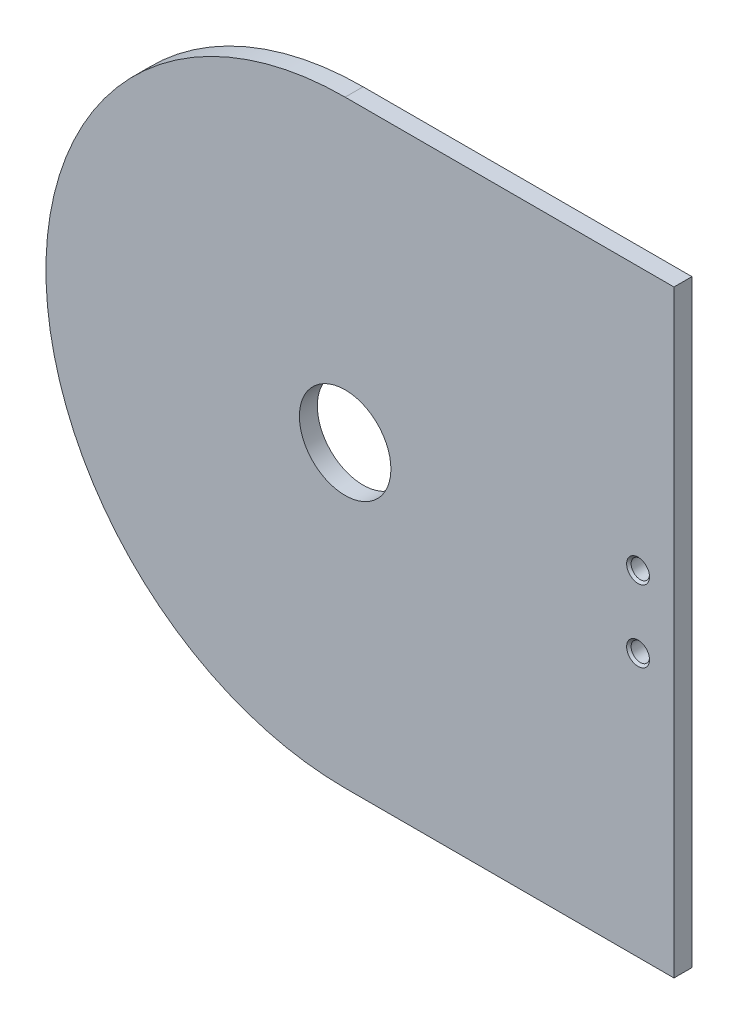
ISO-10303-21;
HEADER;
FILE_DESCRIPTION(('STEP AP214'),'2;1');
FILE_NAME('part.step','',(''),(''),'','','');
FILE_SCHEMA(('AUTOMOTIVE_DESIGN { 1 0 10303 214 1 1 1 1 }'));
ENDSEC;
DATA;
#1=APPLICATION_CONTEXT('core data for automotive mechanical design processes');
#2=APPLICATION_PROTOCOL_DEFINITION('international standard','automotive_design',2000,#1);
#3=PRODUCT_CONTEXT('',#1,'mechanical');
#4=PRODUCT('Part','Part','',(#3));
#5=PRODUCT_RELATED_PRODUCT_CATEGORY('part','',(#4));
#6=PRODUCT_DEFINITION_FORMATION('','',#4);
#7=PRODUCT_DEFINITION_CONTEXT('part definition',#1,'design');
#8=PRODUCT_DEFINITION('design','',#6,#7);
#9=PRODUCT_DEFINITION_SHAPE('','',#8);
#10=(LENGTH_UNIT() NAMED_UNIT(*) SI_UNIT(.MILLI.,.METRE.));
#11=(NAMED_UNIT(*) PLANE_ANGLE_UNIT() SI_UNIT($,.RADIAN.));
#12=(NAMED_UNIT(*) SI_UNIT($,.STERADIAN.) SOLID_ANGLE_UNIT());
#13=UNCERTAINTY_MEASURE_WITH_UNIT(LENGTH_MEASURE(1.E-05),#10,'distance_accuracy_value','');
#14=(GEOMETRIC_REPRESENTATION_CONTEXT(3) GLOBAL_UNCERTAINTY_ASSIGNED_CONTEXT((#13)) GLOBAL_UNIT_ASSIGNED_CONTEXT((#10,
#11,#12)) REPRESENTATION_CONTEXT('',''));
#15=CARTESIAN_POINT('',(0.,0.,0.));
#16=DIRECTION('',(0.,0.,1.));
#17=DIRECTION('',(1.,0.,0.));
#18=AXIS2_PLACEMENT_3D('',#15,#16,#17);
#19=CARTESIAN_POINT('',(0.,82.,0.));
#20=DIRECTION('',(0.,1.,0.));
#21=DIRECTION('',(0.,0.,1.));
#22=AXIS2_PLACEMENT_3D('',#19,#20,#21);
#23=PLANE('',#22);
#24=DIRECTION('',(0.,0.,1.));
#25=VECTOR('',#24,1.);
#26=CARTESIAN_POINT('',(-25.,82.,5.99999999999999));
#27=LINE('',#26,#25);
#28=CARTESIAN_POINT('',(-25.,82.,-39.5));
#29=VERTEX_POINT('',#28);
#30=CARTESIAN_POINT('',(-25.,82.,-37.5));
#31=VERTEX_POINT('',#30);
#32=EDGE_CURVE('E135',#29,#31,#27,.T.);
#33=ORIENTED_EDGE('',*,*,#32,.F.);
#34=DIRECTION('',(1.,0.,0.));
#35=VECTOR('',#34,1.);
#36=CARTESIAN_POINT('',(-95.,82.,-39.5));
#37=LINE('',#36,#35);
#38=CARTESIAN_POINT('',(-61.65,82.,-39.4999999999999));
#39=VERTEX_POINT('',#38);
#40=EDGE_CURVE('E147',#39,#29,#37,.T.);
#41=ORIENTED_EDGE('',*,*,#40,.F.);
#42=DIRECTION('',(0.,0.,-1.));
#43=VECTOR('',#42,1.);
#44=CARTESIAN_POINT('',(-61.65,82.,50.));
#45=LINE('',#44,#43);
#46=CARTESIAN_POINT('',(-61.65,82.,-37.4999999999999));
#47=VERTEX_POINT('',#46);
#48=EDGE_CURVE('E150',#47,#39,#45,.T.);
#49=ORIENTED_EDGE('',*,*,#48,.F.);
#50=DIRECTION('',(1.,0.,0.));
#51=VECTOR('',#50,1.);
#52=CARTESIAN_POINT('',(-95.,82.,-37.5));
#53=LINE('',#52,#51);
#54=EDGE_CURVE('E149',#47,#31,#53,.T.);
#55=ORIENTED_EDGE('',*,*,#54,.T.);
#56=EDGE_LOOP('',(#33,#41,#49,#55));
#57=FACE_BOUND('',#56,.T.);
#58=ADVANCED_FACE('F94',(#57),#23,.T.);
#59=CARTESIAN_POINT('',(-95.,82.,-39.5));
#60=DIRECTION('',(0.,0.,1.));
#61=DIRECTION('',(0.,-1.,0.));
#62=AXIS2_PLACEMENT_3D('',#59,#60,#61);
#63=PLANE('',#62);
#64=CARTESIAN_POINT('',(-29.,44.65,-39.5));
#65=DIRECTION('',(0.,0.,1.));
#66=DIRECTION('',(1.,0.,0.));
#67=AXIS2_PLACEMENT_3D('',#64,#65,#66);
#68=CIRCLE('',#67,1.02499999999999);
#69=CARTESIAN_POINT('',(-27.975,44.65,-39.5));
#70=VERTEX_POINT('',#69);
#71=EDGE_CURVE('E184',#70,#70,#68,.T.);
#72=ORIENTED_EDGE('',*,*,#71,.T.);
#73=EDGE_LOOP('',(#72));
#74=FACE_BOUND('',#73,.T.);
#75=CARTESIAN_POINT('',(-29.,52.65,-39.5));
#76=DIRECTION('',(0.,0.,1.));
#77=DIRECTION('',(1.,0.,0.));
#78=AXIS2_PLACEMENT_3D('',#75,#76,#77);
#79=CIRCLE('',#78,1.02499999999999);
#80=CARTESIAN_POINT('',(-27.975,52.65,-39.5));
#81=VERTEX_POINT('',#80);
#82=EDGE_CURVE('E151',#81,#81,#79,.T.);
#83=ORIENTED_EDGE('',*,*,#82,.T.);
#84=EDGE_LOOP('',(#83));
#85=FACE_BOUND('',#84,.T.);
#86=CARTESIAN_POINT('',(-61.65,48.65,-39.5));
#87=DIRECTION('',(0.,0.,-1.));
#88=DIRECTION('',(0.,1.,0.));
#89=AXIS2_PLACEMENT_3D('',#86,#87,#88);
#90=CIRCLE('',#89,5.1);
#91=CARTESIAN_POINT('',(-61.65,53.75,-39.5));
#92=VERTEX_POINT('',#91);
#93=EDGE_CURVE('E168',#92,#92,#90,.T.);
#94=ORIENTED_EDGE('',*,*,#93,.F.);
#95=EDGE_LOOP('',(#94));
#96=FACE_BOUND('',#95,.T.);
#97=CARTESIAN_POINT('',(-61.65,48.65,-39.5));
#98=DIRECTION('',(0.,0.,1.));
#99=DIRECTION('',(0.,-1.,0.));
#100=AXIS2_PLACEMENT_3D('',#97,#98,#99);
#101=CIRCLE('',#100,33.35);
#102=CARTESIAN_POINT('',(-61.65,15.3,-39.4999999999999));
#103=VERTEX_POINT('',#102);
#104=EDGE_CURVE('E116',#39,#103,#101,.T.);
#105=ORIENTED_EDGE('',*,*,#104,.F.);
#106=ORIENTED_EDGE('',*,*,#40,.T.);
#107=DIRECTION('',(0.,-1.,0.));
#108=VECTOR('',#107,1.);
#109=CARTESIAN_POINT('',(-25.,82.,-39.5));
#110=LINE('',#109,#108);
#111=CARTESIAN_POINT('',(-25.,15.3,-39.5));
#112=VERTEX_POINT('',#111);
#113=EDGE_CURVE('E132',#29,#112,#110,.T.);
#114=ORIENTED_EDGE('',*,*,#113,.T.);
#115=DIRECTION('',(1.,0.,0.));
#116=VECTOR('',#115,1.);
#117=CARTESIAN_POINT('',(-95.,15.3,-39.5));
#118=LINE('',#117,#116);
#119=EDGE_CURVE('E12',#103,#112,#118,.T.);
#120=ORIENTED_EDGE('',*,*,#119,.F.);
#121=EDGE_LOOP('',(#105,#106,#114,#120));
#122=FACE_BOUND('',#121,.T.);
#123=ADVANCED_FACE('F153',(#74,#85,#96,#122),#63,.F.);
#124=CARTESIAN_POINT('',(-95.,82.,-37.5));
#125=DIRECTION('',(0.,0.,-1.));
#126=DIRECTION('',(0.,1.,0.));
#127=AXIS2_PLACEMENT_3D('',#124,#125,#126);
#128=PLANE('',#127);
#129=CARTESIAN_POINT('',(-29.,44.65,-37.5));
#130=DIRECTION('',(0.,0.,1.));
#131=DIRECTION('',(1.,0.,0.));
#132=AXIS2_PLACEMENT_3D('',#129,#130,#131);
#133=CIRCLE('',#132,1.275);
#134=CARTESIAN_POINT('',(-27.725,44.65,-37.5));
#135=VERTEX_POINT('',#134);
#136=EDGE_CURVE('E190',#135,#135,#133,.T.);
#137=ORIENTED_EDGE('',*,*,#136,.F.);
#138=EDGE_LOOP('',(#137));
#139=FACE_BOUND('',#138,.T.);
#140=CARTESIAN_POINT('',(-29.,52.65,-37.5));
#141=DIRECTION('',(0.,0.,1.));
#142=DIRECTION('',(1.,0.,0.));
#143=AXIS2_PLACEMENT_3D('',#140,#141,#142);
#144=CIRCLE('',#143,1.275);
#145=CARTESIAN_POINT('',(-27.725,52.65,-37.5));
#146=VERTEX_POINT('',#145);
#147=EDGE_CURVE('E181',#146,#146,#144,.T.);
#148=ORIENTED_EDGE('',*,*,#147,.F.);
#149=EDGE_LOOP('',(#148));
#150=FACE_BOUND('',#149,.T.);
#151=CARTESIAN_POINT('',(-61.65,48.65,-37.5));
#152=DIRECTION('',(0.,0.,-1.));
#153=DIRECTION('',(0.,1.,0.));
#154=AXIS2_PLACEMENT_3D('',#151,#152,#153);
#155=CIRCLE('',#154,5.1);
#156=CARTESIAN_POINT('',(-61.65,53.75,-37.5));
#157=VERTEX_POINT('',#156);
#158=EDGE_CURVE('E142',#157,#157,#155,.F.);
#159=ORIENTED_EDGE('',*,*,#158,.F.);
#160=EDGE_LOOP('',(#159));
#161=FACE_BOUND('',#160,.T.);
#162=ORIENTED_EDGE('',*,*,#54,.F.);
#163=CARTESIAN_POINT('',(-61.65,48.65,-37.5));
#164=DIRECTION('',(0.,0.,-1.));
#165=DIRECTION('',(0.,1.,0.));
#166=AXIS2_PLACEMENT_3D('',#163,#164,#165);
#167=CIRCLE('',#166,33.35);
#168=CARTESIAN_POINT('',(-61.65,15.3,-37.5));
#169=VERTEX_POINT('',#168);
#170=EDGE_CURVE('E162',#169,#47,#167,.T.);
#171=ORIENTED_EDGE('',*,*,#170,.F.);
#172=DIRECTION('',(1.,0.,0.));
#173=VECTOR('',#172,1.);
#174=CARTESIAN_POINT('',(-95.,15.3,-37.5));
#175=LINE('',#174,#173);
#176=CARTESIAN_POINT('',(-25.,15.3,-37.5));
#177=VERTEX_POINT('',#176);
#178=EDGE_CURVE('E101',#169,#177,#175,.T.);
#179=ORIENTED_EDGE('',*,*,#178,.T.);
#180=DIRECTION('',(0.,1.,0.));
#181=VECTOR('',#180,1.);
#182=CARTESIAN_POINT('',(-25.,82.,-37.5));
#183=LINE('',#182,#181);
#184=EDGE_CURVE('E108',#177,#31,#183,.T.);
#185=ORIENTED_EDGE('',*,*,#184,.T.);
#186=EDGE_LOOP('',(#162,#171,#179,#185));
#187=FACE_BOUND('',#186,.T.);
#188=ADVANCED_FACE('F161',(#139,#150,#161,#187),#128,.F.);
#189=CARTESIAN_POINT('',(-95.,15.3,-39.5));
#190=DIRECTION('',(0.,1.,0.));
#191=DIRECTION('',(0.,0.,1.));
#192=AXIS2_PLACEMENT_3D('',#189,#190,#191);
#193=PLANE('',#192);
#194=ORIENTED_EDGE('',*,*,#178,.F.);
#195=DIRECTION('',(0.,0.,-1.));
#196=VECTOR('',#195,1.);
#197=CARTESIAN_POINT('',(-61.65,15.3,50.));
#198=LINE('',#197,#196);
#199=EDGE_CURVE('E173',#169,#103,#198,.T.);
#200=ORIENTED_EDGE('',*,*,#199,.T.);
#201=ORIENTED_EDGE('',*,*,#119,.T.);
#202=DIRECTION('',(0.,0.,1.));
#203=VECTOR('',#202,1.);
#204=CARTESIAN_POINT('',(-25.,15.3,-39.5));
#205=LINE('',#204,#203);
#206=EDGE_CURVE('E138',#112,#177,#205,.T.);
#207=ORIENTED_EDGE('',*,*,#206,.T.);
#208=EDGE_LOOP('',(#194,#200,#201,#207));
#209=FACE_BOUND('',#208,.T.);
#210=ADVANCED_FACE('F164',(#209),#193,.F.);
#211=CARTESIAN_POINT('',(-61.65,48.65,50.001));
#212=DIRECTION('',(0.,0.,-1.));
#213=DIRECTION('',(0.,1.,0.));
#214=AXIS2_PLACEMENT_3D('',#211,#212,#213);
#215=CYLINDRICAL_SURFACE('',#214,5.1);
#216=ORIENTED_EDGE('',*,*,#93,.T.);
#217=EDGE_LOOP('',(#216));
#218=FACE_BOUND('',#217,.T.);
#219=ORIENTED_EDGE('',*,*,#158,.T.);
#220=EDGE_LOOP('',(#219));
#221=FACE_BOUND('',#220,.T.);
#222=ADVANCED_FACE('F203',(#218,#221),#215,.F.);
#223=CARTESIAN_POINT('',(-61.65,48.65,50.));
#224=DIRECTION('',(0.,0.,-1.));
#225=DIRECTION('',(0.,1.,0.));
#226=AXIS2_PLACEMENT_3D('',#223,#224,#225);
#227=CYLINDRICAL_SURFACE('',#226,33.35);
#228=ORIENTED_EDGE('',*,*,#104,.T.);
#229=ORIENTED_EDGE('',*,*,#199,.F.);
#230=ORIENTED_EDGE('',*,*,#170,.T.);
#231=ORIENTED_EDGE('',*,*,#48,.T.);
#232=EDGE_LOOP('',(#228,#229,#230,#231));
#233=FACE_BOUND('',#232,.T.);
#234=ADVANCED_FACE('F205',(#233),#227,.T.);
#235=CARTESIAN_POINT('',(-25.,0.,5.99999999999999));
#236=DIRECTION('',(-1.,0.,0.));
#237=DIRECTION('',(0.,0.,1.));
#238=AXIS2_PLACEMENT_3D('',#235,#236,#237);
#239=PLANE('',#238);
#240=ORIENTED_EDGE('',*,*,#32,.T.);
#241=ORIENTED_EDGE('',*,*,#184,.F.);
#242=ORIENTED_EDGE('',*,*,#206,.F.);
#243=ORIENTED_EDGE('',*,*,#113,.F.);
#244=EDGE_LOOP('',(#240,#241,#242,#243));
#245=FACE_BOUND('',#244,.T.);
#246=ADVANCED_FACE('F134',(#245),#239,.F.);
#247=CARTESIAN_POINT('',(-29.,52.65,-37.5));
#248=DIRECTION('',(0.,0.,1.));
#249=DIRECTION('',(1.,0.,0.));
#250=AXIS2_PLACEMENT_3D('',#247,#248,#249);
#251=CYLINDRICAL_SURFACE('',#250,1.02499999999999);
#252=ORIENTED_EDGE('',*,*,#82,.F.);
#253=EDGE_LOOP('',(#252));
#254=FACE_BOUND('',#253,.T.);
#255=CARTESIAN_POINT('',(-29.,52.65,-37.75));
#256=DIRECTION('',(0.,0.,1.));
#257=DIRECTION('',(1.,0.,0.));
#258=AXIS2_PLACEMENT_3D('',#255,#256,#257);
#259=CIRCLE('',#258,1.025);
#260=CARTESIAN_POINT('',(-27.975,52.65,-37.75));
#261=VERTEX_POINT('',#260);
#262=EDGE_CURVE('E178',#261,#261,#259,.T.);
#263=ORIENTED_EDGE('',*,*,#262,.T.);
#264=EDGE_LOOP('',(#263));
#265=FACE_BOUND('',#264,.T.);
#266=ADVANCED_FACE('F228',(#254,#265),#251,.F.);
#267=CARTESIAN_POINT('',(-29.,52.65,-37.5));
#268=DIRECTION('',(0.,0.,1.));
#269=DIRECTION('',(1.,0.,0.));
#270=AXIS2_PLACEMENT_3D('',#267,#268,#269);
#271=CONICAL_SURFACE('',#270,1.275,0.785398163397448);
#272=ORIENTED_EDGE('',*,*,#262,.F.);
#273=EDGE_LOOP('',(#272));
#274=FACE_BOUND('',#273,.T.);
#275=ORIENTED_EDGE('',*,*,#147,.T.);
#276=EDGE_LOOP('',(#275));
#277=FACE_BOUND('',#276,.T.);
#278=ADVANCED_FACE('F231',(#274,#277),#271,.F.);
#279=CARTESIAN_POINT('',(-29.,44.65,-37.5));
#280=DIRECTION('',(0.,0.,1.));
#281=DIRECTION('',(1.,0.,0.));
#282=AXIS2_PLACEMENT_3D('',#279,#280,#281);
#283=CYLINDRICAL_SURFACE('',#282,1.02499999999999);
#284=ORIENTED_EDGE('',*,*,#71,.F.);
#285=EDGE_LOOP('',(#284));
#286=FACE_BOUND('',#285,.T.);
#287=CARTESIAN_POINT('',(-29.,44.65,-37.75));
#288=DIRECTION('',(0.,0.,1.));
#289=DIRECTION('',(1.,0.,0.));
#290=AXIS2_PLACEMENT_3D('',#287,#288,#289);
#291=CIRCLE('',#290,1.025);
#292=CARTESIAN_POINT('',(-27.975,44.65,-37.75));
#293=VERTEX_POINT('',#292);
#294=EDGE_CURVE('E187',#293,#293,#291,.T.);
#295=ORIENTED_EDGE('',*,*,#294,.T.);
#296=EDGE_LOOP('',(#295));
#297=FACE_BOUND('',#296,.T.);
#298=ADVANCED_FACE('F237',(#286,#297),#283,.F.);
#299=CARTESIAN_POINT('',(-29.,44.65,-37.5));
#300=DIRECTION('',(0.,0.,1.));
#301=DIRECTION('',(1.,0.,0.));
#302=AXIS2_PLACEMENT_3D('',#299,#300,#301);
#303=CONICAL_SURFACE('',#302,1.275,0.785398163397448);
#304=ORIENTED_EDGE('',*,*,#294,.F.);
#305=EDGE_LOOP('',(#304));
#306=FACE_BOUND('',#305,.T.);
#307=ORIENTED_EDGE('',*,*,#136,.T.);
#308=EDGE_LOOP('',(#307));
#309=FACE_BOUND('',#308,.T.);
#310=ADVANCED_FACE('F194',(#306,#309),#303,.F.);
#311=CLOSED_SHELL('',(#58,#123,#188,#210,#222,#234,#246,#266,#278,#298,#310));
#312=MANIFOLD_SOLID_BREP('B2',#311);
#313=ADVANCED_BREP_SHAPE_REPRESENTATION('',(#18,#312),#14);
#314=SHAPE_DEFINITION_REPRESENTATION(#9,#313);
ENDSEC;
END-ISO-10303-21;
